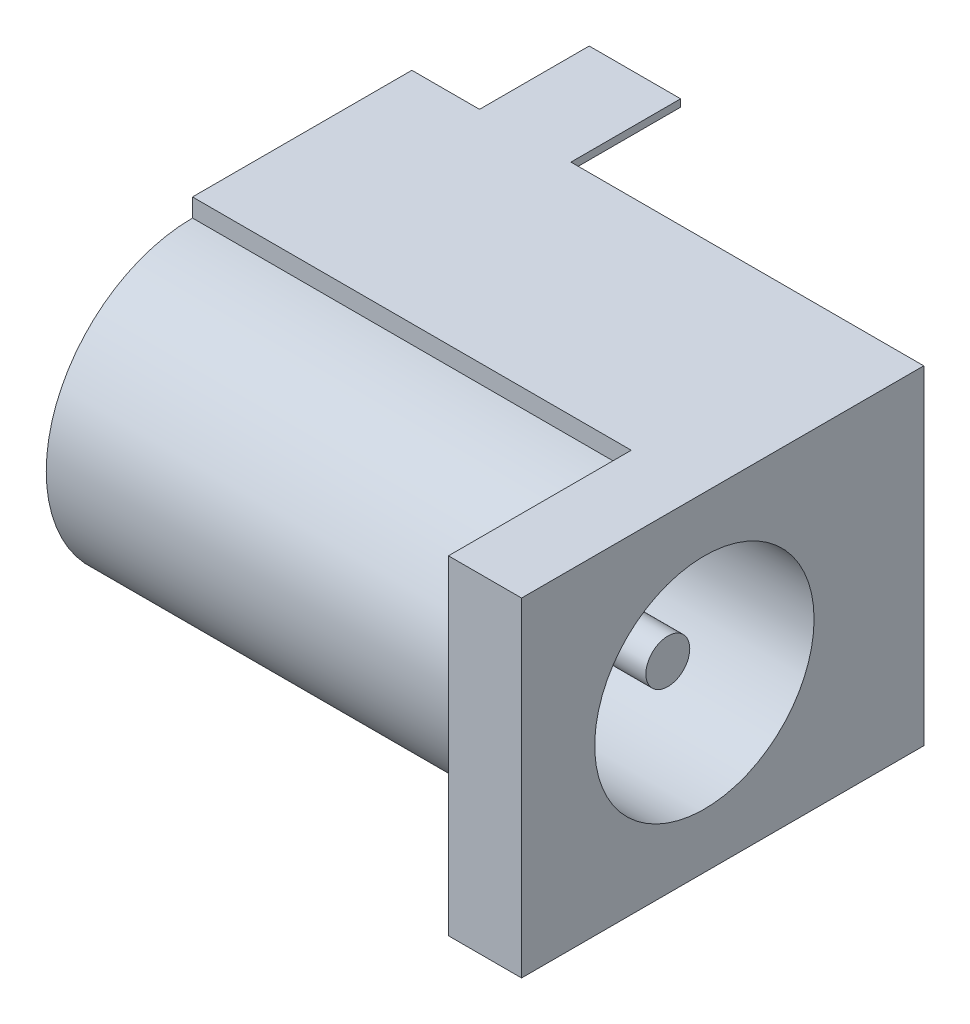
ISO-10303-21;
HEADER;
FILE_DESCRIPTION(('STEP AP214'),'2;1');
FILE_NAME('part.step','',(''),(''),'','','');
FILE_SCHEMA(('AUTOMOTIVE_DESIGN { 1 0 10303 214 1 1 1 1 }'));
ENDSEC;
DATA;
#1=APPLICATION_CONTEXT('core data for automotive mechanical design processes');
#2=APPLICATION_PROTOCOL_DEFINITION('international standard','automotive_design',2000,#1);
#3=PRODUCT_CONTEXT('',#1,'mechanical');
#4=PRODUCT('Part','Part','',(#3));
#5=PRODUCT_RELATED_PRODUCT_CATEGORY('part','',(#4));
#6=PRODUCT_DEFINITION_FORMATION('','',#4);
#7=PRODUCT_DEFINITION_CONTEXT('part definition',#1,'design');
#8=PRODUCT_DEFINITION('design','',#6,#7);
#9=PRODUCT_DEFINITION_SHAPE('','',#8);
#10=(LENGTH_UNIT() NAMED_UNIT(*) SI_UNIT(.MILLI.,.METRE.));
#11=(NAMED_UNIT(*) PLANE_ANGLE_UNIT() SI_UNIT($,.RADIAN.));
#12=(NAMED_UNIT(*) SI_UNIT($,.STERADIAN.) SOLID_ANGLE_UNIT());
#13=UNCERTAINTY_MEASURE_WITH_UNIT(LENGTH_MEASURE(1.E-05),#10,'distance_accuracy_value','');
#14=(GEOMETRIC_REPRESENTATION_CONTEXT(3) GLOBAL_UNCERTAINTY_ASSIGNED_CONTEXT((#13)) GLOBAL_UNIT_ASSIGNED_CONTEXT((#10,
#11,#12)) REPRESENTATION_CONTEXT('',''));
#15=CARTESIAN_POINT('',(0.,0.,0.));
#16=DIRECTION('',(0.,0.,1.));
#17=DIRECTION('',(1.,0.,0.));
#18=AXIS2_PLACEMENT_3D('',#15,#16,#17);
#19=CARTESIAN_POINT('',(7.,-4.5,0.));
#20=DIRECTION('',(0.,0.,-1.));
#21=DIRECTION('',(-1.,0.,0.));
#22=AXIS2_PLACEMENT_3D('',#19,#20,#21);
#23=PLANE('',#22);
#24=DIRECTION('',(-1.,0.,0.));
#25=VECTOR('',#24,1.);
#26=CARTESIAN_POINT('',(0.199999999999969,-1.25,0.));
#27=LINE('',#26,#25);
#28=CARTESIAN_POINT('',(0.199999999999969,-1.25,0.));
#29=VERTEX_POINT('',#28);
#30=CARTESIAN_POINT('',(0.,-1.25,0.));
#31=VERTEX_POINT('',#30);
#32=EDGE_CURVE('E202',#29,#31,#27,.T.);
#33=ORIENTED_EDGE('',*,*,#32,.F.);
#34=DIRECTION('',(0.,-1.,0.));
#35=VECTOR('',#34,1.);
#36=CARTESIAN_POINT('',(0.199999999999969,1.25,0.));
#37=LINE('',#36,#35);
#38=CARTESIAN_POINT('',(0.199999999999969,1.25,0.));
#39=VERTEX_POINT('',#38);
#40=EDGE_CURVE('E199',#39,#29,#37,.T.);
#41=ORIENTED_EDGE('',*,*,#40,.F.);
#42=DIRECTION('',(1.,0.,0.));
#43=VECTOR('',#42,1.);
#44=CARTESIAN_POINT('',(0.199999999999969,1.25,0.));
#45=LINE('',#44,#43);
#46=CARTESIAN_POINT('',(0.,1.25,0.));
#47=VERTEX_POINT('',#46);
#48=EDGE_CURVE('E212',#47,#39,#45,.T.);
#49=ORIENTED_EDGE('',*,*,#48,.F.);
#50=DIRECTION('',(0.,1.,0.));
#51=VECTOR('',#50,1.);
#52=CARTESIAN_POINT('',(0.,1.25,0.));
#53=LINE('',#52,#51);
#54=EDGE_CURVE('E220',#31,#47,#53,.T.);
#55=ORIENTED_EDGE('',*,*,#54,.F.);
#56=EDGE_LOOP('',(#33,#41,#49,#55));
#57=FACE_BOUND('',#56,.T.);
#58=DIRECTION('',(-1.,0.,0.));
#59=VECTOR('',#58,1.);
#60=CARTESIAN_POINT('',(-7.00000000000003,4.5,0.));
#61=LINE('',#60,#59);
#62=CARTESIAN_POINT('',(-5.15000000000003,4.5,0.));
#63=VERTEX_POINT('',#62);
#64=CARTESIAN_POINT('',(-7.00000000000003,4.5,0.));
#65=VERTEX_POINT('',#64);
#66=EDGE_CURVE('E315',#63,#65,#61,.T.);
#67=ORIENTED_EDGE('',*,*,#66,.F.);
#68=DIRECTION('',(0.,1.,0.));
#69=VECTOR('',#68,1.);
#70=CARTESIAN_POINT('',(-5.15000000000003,4.5,0.));
#71=LINE('',#70,#69);
#72=CARTESIAN_POINT('',(-5.15000000000003,4.3,0.));
#73=VERTEX_POINT('',#72);
#74=EDGE_CURVE('E54',#73,#63,#71,.T.);
#75=ORIENTED_EDGE('',*,*,#74,.F.);
#76=DIRECTION('',(-1.,0.,0.));
#77=VECTOR('',#76,1.);
#78=CARTESIAN_POINT('',(-5.15000000000003,4.3,0.));
#79=LINE('',#78,#77);
#80=CARTESIAN_POINT('',(-2.65000000000003,4.3,0.));
#81=VERTEX_POINT('',#80);
#82=EDGE_CURVE('E196',#81,#73,#79,.T.);
#83=ORIENTED_EDGE('',*,*,#82,.F.);
#84=DIRECTION('',(0.,-1.,0.));
#85=VECTOR('',#84,1.);
#86=CARTESIAN_POINT('',(-2.65000000000003,4.5,0.));
#87=LINE('',#86,#85);
#88=CARTESIAN_POINT('',(-2.65000000000003,4.5,0.));
#89=VERTEX_POINT('',#88);
#90=EDGE_CURVE('E314',#89,#81,#87,.T.);
#91=ORIENTED_EDGE('',*,*,#90,.F.);
#92=CARTESIAN_POINT('',(7.,4.5,0.));
#93=VERTEX_POINT('',#92);
#94=EDGE_CURVE('E291',#93,#89,#61,.T.);
#95=ORIENTED_EDGE('',*,*,#94,.F.);
#96=DIRECTION('',(0.,1.,0.));
#97=VECTOR('',#96,1.);
#98=CARTESIAN_POINT('',(7.,4.5,0.));
#99=LINE('',#98,#97);
#100=CARTESIAN_POINT('',(7.,-4.5,0.));
#101=VERTEX_POINT('',#100);
#102=EDGE_CURVE('E312',#101,#93,#99,.T.);
#103=ORIENTED_EDGE('',*,*,#102,.F.);
#104=DIRECTION('',(1.,0.,0.));
#105=VECTOR('',#104,1.);
#106=CARTESIAN_POINT('',(-7.00000000000003,-4.5,0.));
#107=LINE('',#106,#105);
#108=CARTESIAN_POINT('',(-7.00000000000003,-4.5,0.));
#109=VERTEX_POINT('',#108);
#110=EDGE_CURVE('E316',#109,#101,#107,.T.);
#111=ORIENTED_EDGE('',*,*,#110,.F.);
#112=DIRECTION('',(0.,-1.,0.));
#113=VECTOR('',#112,1.);
#114=CARTESIAN_POINT('',(-7.00000000000003,4.5,0.));
#115=LINE('',#114,#113);
#116=CARTESIAN_POINT('',(-7.00000000000003,-1.5,0.));
#117=VERTEX_POINT('',#116);
#118=EDGE_CURVE('E253',#117,#109,#115,.T.);
#119=ORIENTED_EDGE('',*,*,#118,.F.);
#120=DIRECTION('',(-1.,0.,0.));
#121=VECTOR('',#120,1.);
#122=CARTESIAN_POINT('',(-6.80000000000003,-1.5,0.));
#123=LINE('',#122,#121);
#124=CARTESIAN_POINT('',(-6.80000000000003,-1.5,0.));
#125=VERTEX_POINT('',#124);
#126=EDGE_CURVE('E245',#125,#117,#123,.T.);
#127=ORIENTED_EDGE('',*,*,#126,.F.);
#128=DIRECTION('',(0.,-1.,0.));
#129=VECTOR('',#128,1.);
#130=CARTESIAN_POINT('',(-6.80000000000003,1.5,0.));
#131=LINE('',#130,#129);
#132=CARTESIAN_POINT('',(-6.80000000000003,1.5,0.));
#133=VERTEX_POINT('',#132);
#134=EDGE_CURVE('E231',#133,#125,#131,.T.);
#135=ORIENTED_EDGE('',*,*,#134,.F.);
#136=DIRECTION('',(1.,0.,0.));
#137=VECTOR('',#136,1.);
#138=CARTESIAN_POINT('',(-6.80000000000003,1.5,0.));
#139=LINE('',#138,#137);
#140=CARTESIAN_POINT('',(-7.00000000000003,1.5,0.));
#141=VERTEX_POINT('',#140);
#142=EDGE_CURVE('E236',#141,#133,#139,.T.);
#143=ORIENTED_EDGE('',*,*,#142,.F.);
#144=EDGE_CURVE('E280',#65,#141,#115,.T.);
#145=ORIENTED_EDGE('',*,*,#144,.F.);
#146=EDGE_LOOP('',(#67,#75,#83,#91,#95,#103,#111,#119,#127,#135,#143,#145));
#147=FACE_BOUND('',#146,.T.);
#148=ADVANCED_FACE('F37',(#57,#147),#23,.T.);
#149=CARTESIAN_POINT('',(7.,-4.5,11.));
#150=DIRECTION('',(0.,0.,-1.));
#151=DIRECTION('',(-1.,0.,0.));
#152=AXIS2_PLACEMENT_3D('',#149,#150,#151);
#153=PLANE('',#152);
#154=DIRECTION('',(0.,1.,0.));
#155=VECTOR('',#154,1.);
#156=CARTESIAN_POINT('',(4.99999999999997,4.5,11.));
#157=LINE('',#156,#155);
#158=CARTESIAN_POINT('',(4.99999999999997,-4.5,11.));
#159=VERTEX_POINT('',#158);
#160=CARTESIAN_POINT('',(4.99999999999997,4.5,11.));
#161=VERTEX_POINT('',#160);
#162=EDGE_CURVE('E357',#159,#161,#157,.T.);
#163=ORIENTED_EDGE('',*,*,#162,.F.);
#164=DIRECTION('',(1.,0.,0.));
#165=VECTOR('',#164,1.);
#166=CARTESIAN_POINT('',(-7.00000000000003,-4.5,11.));
#167=LINE('',#166,#165);
#168=CARTESIAN_POINT('',(7.,-4.5,11.));
#169=VERTEX_POINT('',#168);
#170=EDGE_CURVE('E288',#159,#169,#167,.T.);
#171=ORIENTED_EDGE('',*,*,#170,.T.);
#172=DIRECTION('',(0.,1.,0.));
#173=VECTOR('',#172,1.);
#174=CARTESIAN_POINT('',(7.,4.5,11.));
#175=LINE('',#174,#173);
#176=CARTESIAN_POINT('',(7.,4.5,11.));
#177=VERTEX_POINT('',#176);
#178=EDGE_CURVE('E289',#169,#177,#175,.T.);
#179=ORIENTED_EDGE('',*,*,#178,.T.);
#180=DIRECTION('',(-1.,0.,0.));
#181=VECTOR('',#180,1.);
#182=CARTESIAN_POINT('',(-7.00000000000003,4.5,11.));
#183=LINE('',#182,#181);
#184=EDGE_CURVE('E301',#177,#161,#183,.T.);
#185=ORIENTED_EDGE('',*,*,#184,.T.);
#186=EDGE_LOOP('',(#163,#171,#179,#185));
#187=FACE_BOUND('',#186,.T.);
#188=ADVANCED_FACE('F401',(#187),#153,.F.);
#189=CARTESIAN_POINT('',(-1.,0.,6.));
#190=DIRECTION('',(1.,0.,0.));
#191=DIRECTION('',(0.,0.,-1.));
#192=AXIS2_PLACEMENT_3D('',#189,#190,#191);
#193=PLANE('',#192);
#194=CARTESIAN_POINT('',(-1.,0.,6.));
#195=DIRECTION('',(1.,0.,0.));
#196=DIRECTION('',(0.,0.,-1.));
#197=AXIS2_PLACEMENT_3D('',#194,#195,#196);
#198=CIRCLE('',#197,3.);
#199=CARTESIAN_POINT('',(-1.,0.,3.));
#200=VERTEX_POINT('',#199);
#201=EDGE_CURVE('E318',#200,#200,#198,.T.);
#202=ORIENTED_EDGE('',*,*,#201,.T.);
#203=EDGE_LOOP('',(#202));
#204=FACE_BOUND('',#203,.T.);
#205=CARTESIAN_POINT('',(-1.,0.,6.));
#206=DIRECTION('',(1.,0.,0.));
#207=DIRECTION('',(0.,0.,-1.));
#208=AXIS2_PLACEMENT_3D('',#205,#206,#207);
#209=CIRCLE('',#208,0.6);
#210=CARTESIAN_POINT('',(-1.,0.,5.4));
#211=VERTEX_POINT('',#210);
#212=EDGE_CURVE('E329',#211,#211,#209,.T.);
#213=ORIENTED_EDGE('',*,*,#212,.F.);
#214=EDGE_LOOP('',(#213));
#215=FACE_BOUND('',#214,.T.);
#216=ADVANCED_FACE('F407',(#204,#215),#193,.T.);
#217=CARTESIAN_POINT('',(-7.00000000000003,-4.5,11.));
#218=DIRECTION('',(0.,1.,0.));
#219=DIRECTION('',(0.,0.,1.));
#220=AXIS2_PLACEMENT_3D('',#217,#218,#219);
#221=PLANE('',#220);
#222=DIRECTION('',(0.,0.,1.));
#223=VECTOR('',#222,1.);
#224=CARTESIAN_POINT('',(4.99999999999997,-4.5,11.));
#225=LINE('',#224,#223);
#226=CARTESIAN_POINT('',(4.99999999999997,-4.5,6.));
#227=VERTEX_POINT('',#226);
#228=EDGE_CURVE('E359',#227,#159,#225,.T.);
#229=ORIENTED_EDGE('',*,*,#228,.F.);
#230=DIRECTION('',(-1.,0.,0.));
#231=VECTOR('',#230,1.);
#232=CARTESIAN_POINT('',(4.99999999999997,-4.5,6.));
#233=LINE('',#232,#231);
#234=CARTESIAN_POINT('',(-7.00000000000003,-4.5,6.));
#235=VERTEX_POINT('',#234);
#236=EDGE_CURVE('E337',#227,#235,#233,.T.);
#237=ORIENTED_EDGE('',*,*,#236,.T.);
#238=DIRECTION('',(0.,0.,-1.));
#239=VECTOR('',#238,1.);
#240=CARTESIAN_POINT('',(-7.00000000000003,-4.5,11.));
#241=LINE('',#240,#239);
#242=EDGE_CURVE('E297',#235,#109,#241,.T.);
#243=ORIENTED_EDGE('',*,*,#242,.T.);
#244=ORIENTED_EDGE('',*,*,#110,.T.);
#245=DIRECTION('',(0.,0.,-1.));
#246=VECTOR('',#245,1.);
#247=CARTESIAN_POINT('',(7.,-4.5,11.));
#248=LINE('',#247,#246);
#249=EDGE_CURVE('E11',#169,#101,#248,.T.);
#250=ORIENTED_EDGE('',*,*,#249,.F.);
#251=ORIENTED_EDGE('',*,*,#170,.F.);
#252=EDGE_LOOP('',(#229,#237,#243,#244,#250,#251));
#253=FACE_BOUND('',#252,.T.);
#254=ADVANCED_FACE('F39',(#253),#221,.F.);
#255=CARTESIAN_POINT('',(7.,4.5,11.));
#256=DIRECTION('',(-1.,0.,0.));
#257=DIRECTION('',(0.,0.,1.));
#258=AXIS2_PLACEMENT_3D('',#255,#256,#257);
#259=PLANE('',#258);
#260=CARTESIAN_POINT('',(7.,0.,6.));
#261=DIRECTION('',(1.,0.,0.));
#262=DIRECTION('',(0.,0.,-1.));
#263=AXIS2_PLACEMENT_3D('',#260,#261,#262);
#264=CIRCLE('',#263,3.);
#265=CARTESIAN_POINT('',(7.,0.,3.));
#266=VERTEX_POINT('',#265);
#267=EDGE_CURVE('E323',#266,#266,#264,.T.);
#268=ORIENTED_EDGE('',*,*,#267,.F.);
#269=EDGE_LOOP('',(#268));
#270=FACE_BOUND('',#269,.T.);
#271=ORIENTED_EDGE('',*,*,#102,.T.);
#272=DIRECTION('',(0.,0.,-1.));
#273=VECTOR('',#272,1.);
#274=CARTESIAN_POINT('',(7.,4.5,11.));
#275=LINE('',#274,#273);
#276=EDGE_CURVE('E46',#177,#93,#275,.T.);
#277=ORIENTED_EDGE('',*,*,#276,.F.);
#278=ORIENTED_EDGE('',*,*,#178,.F.);
#279=ORIENTED_EDGE('',*,*,#249,.T.);
#280=EDGE_LOOP('',(#271,#277,#278,#279));
#281=FACE_BOUND('',#280,.T.);
#282=ADVANCED_FACE('F417',(#270,#281),#259,.F.);
#283=CARTESIAN_POINT('',(-7.00000000000003,4.5,11.));
#284=DIRECTION('',(0.,-1.,0.));
#285=DIRECTION('',(0.,0.,-1.));
#286=AXIS2_PLACEMENT_3D('',#283,#284,#285);
#287=PLANE('',#286);
#288=DIRECTION('',(0.,0.,-1.));
#289=VECTOR('',#288,1.);
#290=CARTESIAN_POINT('',(-7.00000000000003,4.5,11.));
#291=LINE('',#290,#289);
#292=CARTESIAN_POINT('',(-7.00000000000003,4.5,6.));
#293=VERTEX_POINT('',#292);
#294=EDGE_CURVE('E287',#293,#65,#291,.T.);
#295=ORIENTED_EDGE('',*,*,#294,.F.);
#296=DIRECTION('',(-1.,0.,0.));
#297=VECTOR('',#296,1.);
#298=CARTESIAN_POINT('',(4.99999999999997,4.5,6.));
#299=LINE('',#298,#297);
#300=CARTESIAN_POINT('',(4.99999999999997,4.5,6.));
#301=VERTEX_POINT('',#300);
#302=EDGE_CURVE('E341',#301,#293,#299,.T.);
#303=ORIENTED_EDGE('',*,*,#302,.F.);
#304=DIRECTION('',(0.,0.,-1.));
#305=VECTOR('',#304,1.);
#306=CARTESIAN_POINT('',(4.99999999999997,4.5,6.));
#307=LINE('',#306,#305);
#308=EDGE_CURVE('E355',#161,#301,#307,.T.);
#309=ORIENTED_EDGE('',*,*,#308,.F.);
#310=ORIENTED_EDGE('',*,*,#184,.F.);
#311=ORIENTED_EDGE('',*,*,#276,.T.);
#312=ORIENTED_EDGE('',*,*,#94,.T.);
#313=DIRECTION('',(0.,0.,1.));
#314=VECTOR('',#313,1.);
#315=CARTESIAN_POINT('',(-2.65000000000003,4.5,-3.));
#316=LINE('',#315,#314);
#317=CARTESIAN_POINT('',(-2.65000000000003,4.5,-3.));
#318=VERTEX_POINT('',#317);
#319=EDGE_CURVE('E185',#318,#89,#316,.T.);
#320=ORIENTED_EDGE('',*,*,#319,.F.);
#321=DIRECTION('',(1.,0.,0.));
#322=VECTOR('',#321,1.);
#323=CARTESIAN_POINT('',(-2.65000000000003,4.5,-3.));
#324=LINE('',#323,#322);
#325=CARTESIAN_POINT('',(-5.15000000000003,4.5,-3.));
#326=VERTEX_POINT('',#325);
#327=EDGE_CURVE('E178',#326,#318,#324,.T.);
#328=ORIENTED_EDGE('',*,*,#327,.F.);
#329=DIRECTION('',(0.,0.,1.));
#330=VECTOR('',#329,1.);
#331=CARTESIAN_POINT('',(-5.15000000000003,4.5,-3.));
#332=LINE('',#331,#330);
#333=EDGE_CURVE('E182',#326,#63,#332,.T.);
#334=ORIENTED_EDGE('',*,*,#333,.T.);
#335=ORIENTED_EDGE('',*,*,#66,.T.);
#336=EDGE_LOOP('',(#295,#303,#309,#310,#311,#312,#320,#328,#334,#335));
#337=FACE_BOUND('',#336,.T.);
#338=ADVANCED_FACE('F181',(#337),#287,.F.);
#339=CARTESIAN_POINT('',(-7.00000000000003,4.5,11.));
#340=DIRECTION('',(1.,0.,0.));
#341=DIRECTION('',(0.,0.,-1.));
#342=AXIS2_PLACEMENT_3D('',#339,#340,#341);
#343=PLANE('',#342);
#344=CARTESIAN_POINT('',(-7.00000000000003,0.,6.));
#345=DIRECTION('',(1.,0.,0.));
#346=DIRECTION('',(0.,0.,1.));
#347=AXIS2_PLACEMENT_3D('',#344,#345,#346);
#348=CIRCLE('',#347,4.);
#349=CARTESIAN_POINT('',(-7.00000000000003,4.,6.));
#350=VERTEX_POINT('',#349);
#351=CARTESIAN_POINT('',(-7.00000000000003,-4.,6.));
#352=VERTEX_POINT('',#351);
#353=EDGE_CURVE('E350',#350,#352,#348,.T.);
#354=ORIENTED_EDGE('',*,*,#353,.F.);
#355=DIRECTION('',(0.,-1.,0.));
#356=VECTOR('',#355,1.);
#357=CARTESIAN_POINT('',(-7.00000000000003,4.,6.));
#358=LINE('',#357,#356);
#359=EDGE_CURVE('E344',#293,#350,#358,.T.);
#360=ORIENTED_EDGE('',*,*,#359,.F.);
#361=ORIENTED_EDGE('',*,*,#294,.T.);
#362=ORIENTED_EDGE('',*,*,#144,.T.);
#363=DIRECTION('',(0.,0.,1.));
#364=VECTOR('',#363,1.);
#365=CARTESIAN_POINT('',(-7.00000000000003,1.5,-3.));
#366=LINE('',#365,#364);
#367=CARTESIAN_POINT('',(-7.00000000000003,1.5,-3.));
#368=VERTEX_POINT('',#367);
#369=EDGE_CURVE('E260',#368,#141,#366,.T.);
#370=ORIENTED_EDGE('',*,*,#369,.F.);
#371=DIRECTION('',(0.,1.,0.));
#372=VECTOR('',#371,1.);
#373=CARTESIAN_POINT('',(-7.00000000000003,1.5,-3.));
#374=LINE('',#373,#372);
#375=CARTESIAN_POINT('',(-7.00000000000003,-1.5,-3.));
#376=VERTEX_POINT('',#375);
#377=EDGE_CURVE('E238',#376,#368,#374,.T.);
#378=ORIENTED_EDGE('',*,*,#377,.F.);
#379=DIRECTION('',(0.,0.,1.));
#380=VECTOR('',#379,1.);
#381=CARTESIAN_POINT('',(-7.00000000000003,-1.5,-3.));
#382=LINE('',#381,#380);
#383=EDGE_CURVE('E256',#376,#117,#382,.T.);
#384=ORIENTED_EDGE('',*,*,#383,.T.);
#385=ORIENTED_EDGE('',*,*,#118,.T.);
#386=ORIENTED_EDGE('',*,*,#242,.F.);
#387=DIRECTION('',(0.,-1.,0.));
#388=VECTOR('',#387,1.);
#389=CARTESIAN_POINT('',(-7.00000000000003,-4.5,6.));
#390=LINE('',#389,#388);
#391=EDGE_CURVE('E348',#352,#235,#390,.T.);
#392=ORIENTED_EDGE('',*,*,#391,.F.);
#393=EDGE_LOOP('',(#354,#360,#361,#362,#370,#378,#384,#385,#386,#392));
#394=FACE_BOUND('',#393,.T.);
#395=ADVANCED_FACE('F284',(#394),#343,.F.);
#396=CARTESIAN_POINT('',(-1.,0.,6.));
#397=DIRECTION('',(1.,0.,0.));
#398=DIRECTION('',(0.,0.,-1.));
#399=AXIS2_PLACEMENT_3D('',#396,#397,#398);
#400=CYLINDRICAL_SURFACE('',#399,3.);
#401=ORIENTED_EDGE('',*,*,#201,.F.);
#402=EDGE_LOOP('',(#401));
#403=FACE_BOUND('',#402,.T.);
#404=ORIENTED_EDGE('',*,*,#267,.T.);
#405=EDGE_LOOP('',(#404));
#406=FACE_BOUND('',#405,.T.);
#407=ADVANCED_FACE('F415',(#403,#406),#400,.F.);
#408=CARTESIAN_POINT('',(6.,0.,6.));
#409=DIRECTION('',(-1.,0.,0.));
#410=DIRECTION('',(0.,0.,1.));
#411=AXIS2_PLACEMENT_3D('',#408,#409,#410);
#412=CYLINDRICAL_SURFACE('',#411,0.6);
#413=CARTESIAN_POINT('',(6.,0.,6.));
#414=DIRECTION('',(1.,0.,0.));
#415=DIRECTION('',(0.,0.,-1.));
#416=AXIS2_PLACEMENT_3D('',#413,#414,#415);
#417=CIRCLE('',#416,0.6);
#418=CARTESIAN_POINT('',(6.,0.,5.4));
#419=VERTEX_POINT('',#418);
#420=EDGE_CURVE('E326',#419,#419,#417,.T.);
#421=ORIENTED_EDGE('',*,*,#420,.F.);
#422=EDGE_LOOP('',(#421));
#423=FACE_BOUND('',#422,.T.);
#424=ORIENTED_EDGE('',*,*,#212,.T.);
#425=EDGE_LOOP('',(#424));
#426=FACE_BOUND('',#425,.T.);
#427=ADVANCED_FACE('F426',(#423,#426),#412,.T.);
#428=CARTESIAN_POINT('',(6.,0.,6.));
#429=DIRECTION('',(1.,0.,0.));
#430=DIRECTION('',(0.,0.,-1.));
#431=AXIS2_PLACEMENT_3D('',#428,#429,#430);
#432=PLANE('',#431);
#433=ORIENTED_EDGE('',*,*,#420,.T.);
#434=EDGE_LOOP('',(#433));
#435=FACE_BOUND('',#434,.T.);
#436=ADVANCED_FACE('F397',(#435),#432,.T.);
#437=CARTESIAN_POINT('',(4.99999999999997,0.,6.));
#438=DIRECTION('',(-1.,0.,0.));
#439=DIRECTION('',(0.,0.,1.));
#440=AXIS2_PLACEMENT_3D('',#437,#438,#439);
#441=CYLINDRICAL_SURFACE('',#440,4.);
#442=ORIENTED_EDGE('',*,*,#353,.T.);
#443=DIRECTION('',(-1.,0.,0.));
#444=VECTOR('',#443,1.);
#445=CARTESIAN_POINT('',(4.99999999999997,-4.,6.));
#446=LINE('',#445,#444);
#447=CARTESIAN_POINT('',(4.99999999999997,-4.,6.));
#448=VERTEX_POINT('',#447);
#449=EDGE_CURVE('E335',#448,#352,#446,.T.);
#450=ORIENTED_EDGE('',*,*,#449,.F.);
#451=CARTESIAN_POINT('',(4.99999999999997,0.,6.));
#452=DIRECTION('',(1.,0.,0.));
#453=DIRECTION('',(0.,0.,1.));
#454=AXIS2_PLACEMENT_3D('',#451,#452,#453);
#455=CIRCLE('',#454,4.);
#456=CARTESIAN_POINT('',(4.99999999999997,4.,6.));
#457=VERTEX_POINT('',#456);
#458=EDGE_CURVE('E347',#457,#448,#455,.T.);
#459=ORIENTED_EDGE('',*,*,#458,.F.);
#460=DIRECTION('',(-1.,0.,0.));
#461=VECTOR('',#460,1.);
#462=CARTESIAN_POINT('',(4.99999999999997,4.,6.));
#463=LINE('',#462,#461);
#464=EDGE_CURVE('E332',#457,#350,#463,.T.);
#465=ORIENTED_EDGE('',*,*,#464,.T.);
#466=EDGE_LOOP('',(#442,#450,#459,#465));
#467=FACE_BOUND('',#466,.T.);
#468=ADVANCED_FACE('F386',(#467),#441,.T.);
#469=CARTESIAN_POINT('',(4.99999999999997,4.,6.));
#470=DIRECTION('',(0.,0.,-1.));
#471=DIRECTION('',(-1.,0.,0.));
#472=AXIS2_PLACEMENT_3D('',#469,#470,#471);
#473=PLANE('',#472);
#474=ORIENTED_EDGE('',*,*,#359,.T.);
#475=ORIENTED_EDGE('',*,*,#464,.F.);
#476=DIRECTION('',(0.,-1.,0.));
#477=VECTOR('',#476,1.);
#478=CARTESIAN_POINT('',(4.99999999999997,4.,6.));
#479=LINE('',#478,#477);
#480=EDGE_CURVE('E338',#301,#457,#479,.T.);
#481=ORIENTED_EDGE('',*,*,#480,.F.);
#482=ORIENTED_EDGE('',*,*,#302,.T.);
#483=EDGE_LOOP('',(#474,#475,#481,#482));
#484=FACE_BOUND('',#483,.T.);
#485=ADVANCED_FACE('F389',(#484),#473,.F.);
#486=CARTESIAN_POINT('',(4.99999999999997,-4.5,6.));
#487=DIRECTION('',(0.,0.,-1.));
#488=DIRECTION('',(-1.,0.,0.));
#489=AXIS2_PLACEMENT_3D('',#486,#487,#488);
#490=PLANE('',#489);
#491=ORIENTED_EDGE('',*,*,#391,.T.);
#492=ORIENTED_EDGE('',*,*,#236,.F.);
#493=DIRECTION('',(0.,-1.,0.));
#494=VECTOR('',#493,1.);
#495=CARTESIAN_POINT('',(4.99999999999997,-4.5,6.));
#496=LINE('',#495,#494);
#497=EDGE_CURVE('E361',#448,#227,#496,.T.);
#498=ORIENTED_EDGE('',*,*,#497,.F.);
#499=ORIENTED_EDGE('',*,*,#449,.T.);
#500=EDGE_LOOP('',(#491,#492,#498,#499));
#501=FACE_BOUND('',#500,.T.);
#502=ADVANCED_FACE('F379',(#501),#490,.F.);
#503=CARTESIAN_POINT('',(4.99999999999997,0.,6.));
#504=DIRECTION('',(-1.,0.,0.));
#505=DIRECTION('',(0.,0.,1.));
#506=AXIS2_PLACEMENT_3D('',#503,#504,#505);
#507=PLANE('',#506);
#508=ORIENTED_EDGE('',*,*,#458,.T.);
#509=ORIENTED_EDGE('',*,*,#497,.T.);
#510=ORIENTED_EDGE('',*,*,#228,.T.);
#511=ORIENTED_EDGE('',*,*,#162,.T.);
#512=ORIENTED_EDGE('',*,*,#308,.T.);
#513=ORIENTED_EDGE('',*,*,#480,.T.);
#514=EDGE_LOOP('',(#508,#509,#510,#511,#512,#513));
#515=FACE_BOUND('',#514,.T.);
#516=ADVANCED_FACE('F381',(#515),#507,.T.);
#517=CARTESIAN_POINT('',(-6.80000000000003,1.5,-3.));
#518=DIRECTION('',(-1.,0.,0.));
#519=DIRECTION('',(0.,0.,1.));
#520=AXIS2_PLACEMENT_3D('',#517,#518,#519);
#521=PLANE('',#520);
#522=ORIENTED_EDGE('',*,*,#134,.T.);
#523=DIRECTION('',(0.,0.,1.));
#524=VECTOR('',#523,1.);
#525=CARTESIAN_POINT('',(-6.80000000000003,-1.5,-3.));
#526=LINE('',#525,#524);
#527=CARTESIAN_POINT('',(-6.80000000000003,-1.5,-3.));
#528=VERTEX_POINT('',#527);
#529=EDGE_CURVE('E259',#528,#125,#526,.T.);
#530=ORIENTED_EDGE('',*,*,#529,.F.);
#531=DIRECTION('',(0.,-1.,0.));
#532=VECTOR('',#531,1.);
#533=CARTESIAN_POINT('',(-6.80000000000003,1.5,-3.));
#534=LINE('',#533,#532);
#535=CARTESIAN_POINT('',(-6.80000000000003,1.5,-3.));
#536=VERTEX_POINT('',#535);
#537=EDGE_CURVE('E232',#536,#528,#534,.T.);
#538=ORIENTED_EDGE('',*,*,#537,.F.);
#539=DIRECTION('',(0.,0.,1.));
#540=VECTOR('',#539,1.);
#541=CARTESIAN_POINT('',(-6.80000000000003,1.5,-3.));
#542=LINE('',#541,#540);
#543=EDGE_CURVE('E242',#536,#133,#542,.T.);
#544=ORIENTED_EDGE('',*,*,#543,.T.);
#545=EDGE_LOOP('',(#522,#530,#538,#544));
#546=FACE_BOUND('',#545,.T.);
#547=ADVANCED_FACE('F274',(#546),#521,.F.);
#548=CARTESIAN_POINT('',(-6.80000000000003,-1.5,-3.));
#549=DIRECTION('',(0.,1.,0.));
#550=DIRECTION('',(0.,0.,1.));
#551=AXIS2_PLACEMENT_3D('',#548,#549,#550);
#552=PLANE('',#551);
#553=ORIENTED_EDGE('',*,*,#126,.T.);
#554=ORIENTED_EDGE('',*,*,#383,.F.);
#555=DIRECTION('',(-1.,0.,0.));
#556=VECTOR('',#555,1.);
#557=CARTESIAN_POINT('',(-6.80000000000003,-1.5,-3.));
#558=LINE('',#557,#556);
#559=EDGE_CURVE('E235',#528,#376,#558,.T.);
#560=ORIENTED_EDGE('',*,*,#559,.F.);
#561=ORIENTED_EDGE('',*,*,#529,.T.);
#562=EDGE_LOOP('',(#553,#554,#560,#561));
#563=FACE_BOUND('',#562,.T.);
#564=ADVANCED_FACE('F367',(#563),#552,.F.);
#565=CARTESIAN_POINT('',(-6.80000000000003,1.5,-3.));
#566=DIRECTION('',(0.,-1.,0.));
#567=DIRECTION('',(0.,0.,-1.));
#568=AXIS2_PLACEMENT_3D('',#565,#566,#567);
#569=PLANE('',#568);
#570=ORIENTED_EDGE('',*,*,#142,.T.);
#571=ORIENTED_EDGE('',*,*,#543,.F.);
#572=DIRECTION('',(1.,0.,0.));
#573=VECTOR('',#572,1.);
#574=CARTESIAN_POINT('',(-6.80000000000003,1.5,-3.));
#575=LINE('',#574,#573);
#576=EDGE_CURVE('E240',#368,#536,#575,.T.);
#577=ORIENTED_EDGE('',*,*,#576,.F.);
#578=ORIENTED_EDGE('',*,*,#369,.T.);
#579=EDGE_LOOP('',(#570,#571,#577,#578));
#580=FACE_BOUND('',#579,.T.);
#581=ADVANCED_FACE('F276',(#580),#569,.F.);
#582=CARTESIAN_POINT('',(-6.80000000000003,-1.5,-3.));
#583=DIRECTION('',(0.,0.,-1.));
#584=DIRECTION('',(-1.,0.,0.));
#585=AXIS2_PLACEMENT_3D('',#582,#583,#584);
#586=PLANE('',#585);
#587=ORIENTED_EDGE('',*,*,#537,.T.);
#588=ORIENTED_EDGE('',*,*,#559,.T.);
#589=ORIENTED_EDGE('',*,*,#377,.T.);
#590=ORIENTED_EDGE('',*,*,#576,.T.);
#591=EDGE_LOOP('',(#587,#588,#589,#590));
#592=FACE_BOUND('',#591,.T.);
#593=ADVANCED_FACE('F370',(#592),#586,.T.);
#594=CARTESIAN_POINT('',(0.199999999999969,1.25,-3.));
#595=DIRECTION('',(-1.,0.,0.));
#596=DIRECTION('',(0.,0.,1.));
#597=AXIS2_PLACEMENT_3D('',#594,#595,#596);
#598=PLANE('',#597);
#599=ORIENTED_EDGE('',*,*,#40,.T.);
#600=DIRECTION('',(0.,0.,1.));
#601=VECTOR('',#600,1.);
#602=CARTESIAN_POINT('',(0.199999999999969,-1.25,-3.));
#603=LINE('',#602,#601);
#604=CARTESIAN_POINT('',(0.199999999999969,-1.25,-3.));
#605=VERTEX_POINT('',#604);
#606=EDGE_CURVE('E229',#605,#29,#603,.T.);
#607=ORIENTED_EDGE('',*,*,#606,.F.);
#608=DIRECTION('',(0.,-1.,0.));
#609=VECTOR('',#608,1.);
#610=CARTESIAN_POINT('',(0.199999999999969,1.25,-3.));
#611=LINE('',#610,#609);
#612=CARTESIAN_POINT('',(0.199999999999969,1.25,-3.));
#613=VERTEX_POINT('',#612);
#614=EDGE_CURVE('E208',#613,#605,#611,.T.);
#615=ORIENTED_EDGE('',*,*,#614,.F.);
#616=DIRECTION('',(0.,0.,1.));
#617=VECTOR('',#616,1.);
#618=CARTESIAN_POINT('',(0.199999999999969,1.25,-3.));
#619=LINE('',#618,#617);
#620=EDGE_CURVE('E217',#613,#39,#619,.T.);
#621=ORIENTED_EDGE('',*,*,#620,.T.);
#622=EDGE_LOOP('',(#599,#607,#615,#621));
#623=FACE_BOUND('',#622,.T.);
#624=ADVANCED_FACE('F536',(#623),#598,.F.);
#625=CARTESIAN_POINT('',(0.199999999999969,-1.25,-3.));
#626=DIRECTION('',(0.,1.,0.));
#627=DIRECTION('',(0.,0.,1.));
#628=AXIS2_PLACEMENT_3D('',#625,#626,#627);
#629=PLANE('',#628);
#630=ORIENTED_EDGE('',*,*,#32,.T.);
#631=DIRECTION('',(0.,0.,1.));
#632=VECTOR('',#631,1.);
#633=CARTESIAN_POINT('',(0.,-1.25,-3.));
#634=LINE('',#633,#632);
#635=CARTESIAN_POINT('',(0.,-1.25,-3.));
#636=VERTEX_POINT('',#635);
#637=EDGE_CURVE('E226',#636,#31,#634,.T.);
#638=ORIENTED_EDGE('',*,*,#637,.F.);
#639=DIRECTION('',(-1.,0.,0.));
#640=VECTOR('',#639,1.);
#641=CARTESIAN_POINT('',(0.199999999999969,-1.25,-3.));
#642=LINE('',#641,#640);
#643=EDGE_CURVE('E211',#605,#636,#642,.T.);
#644=ORIENTED_EDGE('',*,*,#643,.F.);
#645=ORIENTED_EDGE('',*,*,#606,.T.);
#646=EDGE_LOOP('',(#630,#638,#644,#645));
#647=FACE_BOUND('',#646,.T.);
#648=ADVANCED_FACE('F544',(#647),#629,.F.);
#649=CARTESIAN_POINT('',(0.,1.25,-3.));
#650=DIRECTION('',(1.,0.,0.));
#651=DIRECTION('',(0.,0.,-1.));
#652=AXIS2_PLACEMENT_3D('',#649,#650,#651);
#653=PLANE('',#652);
#654=ORIENTED_EDGE('',*,*,#54,.T.);
#655=DIRECTION('',(0.,0.,1.));
#656=VECTOR('',#655,1.);
#657=CARTESIAN_POINT('',(0.,1.25,-3.));
#658=LINE('',#657,#656);
#659=CARTESIAN_POINT('',(0.,1.25,-3.));
#660=VERTEX_POINT('',#659);
#661=EDGE_CURVE('E62',#660,#47,#658,.T.);
#662=ORIENTED_EDGE('',*,*,#661,.F.);
#663=DIRECTION('',(0.,1.,0.));
#664=VECTOR('',#663,1.);
#665=CARTESIAN_POINT('',(0.,1.25,-3.));
#666=LINE('',#665,#664);
#667=EDGE_CURVE('E214',#636,#660,#666,.T.);
#668=ORIENTED_EDGE('',*,*,#667,.F.);
#669=ORIENTED_EDGE('',*,*,#637,.T.);
#670=EDGE_LOOP('',(#654,#662,#668,#669));
#671=FACE_BOUND('',#670,.T.);
#672=ADVANCED_FACE('F553',(#671),#653,.F.);
#673=CARTESIAN_POINT('',(0.199999999999969,1.25,-3.));
#674=DIRECTION('',(0.,-1.,0.));
#675=DIRECTION('',(0.,0.,-1.));
#676=AXIS2_PLACEMENT_3D('',#673,#674,#675);
#677=PLANE('',#676);
#678=ORIENTED_EDGE('',*,*,#48,.T.);
#679=ORIENTED_EDGE('',*,*,#620,.F.);
#680=DIRECTION('',(1.,0.,0.));
#681=VECTOR('',#680,1.);
#682=CARTESIAN_POINT('',(0.199999999999969,1.25,-3.));
#683=LINE('',#682,#681);
#684=EDGE_CURVE('E216',#660,#613,#683,.T.);
#685=ORIENTED_EDGE('',*,*,#684,.F.);
#686=ORIENTED_EDGE('',*,*,#661,.T.);
#687=EDGE_LOOP('',(#678,#679,#685,#686));
#688=FACE_BOUND('',#687,.T.);
#689=ADVANCED_FACE('F562',(#688),#677,.F.);
#690=CARTESIAN_POINT('',(0.199999999999969,-1.25,-3.));
#691=DIRECTION('',(0.,0.,-1.));
#692=DIRECTION('',(-1.,0.,0.));
#693=AXIS2_PLACEMENT_3D('',#690,#691,#692);
#694=PLANE('',#693);
#695=ORIENTED_EDGE('',*,*,#614,.T.);
#696=ORIENTED_EDGE('',*,*,#643,.T.);
#697=ORIENTED_EDGE('',*,*,#667,.T.);
#698=ORIENTED_EDGE('',*,*,#684,.T.);
#699=EDGE_LOOP('',(#695,#696,#697,#698));
#700=FACE_BOUND('',#699,.T.);
#701=ADVANCED_FACE('F571',(#700),#694,.T.);
#702=CARTESIAN_POINT('',(-5.15000000000003,4.5,-3.));
#703=DIRECTION('',(1.,0.,0.));
#704=DIRECTION('',(0.,0.,-1.));
#705=AXIS2_PLACEMENT_3D('',#702,#703,#704);
#706=PLANE('',#705);
#707=ORIENTED_EDGE('',*,*,#74,.T.);
#708=ORIENTED_EDGE('',*,*,#333,.F.);
#709=DIRECTION('',(0.,1.,0.));
#710=VECTOR('',#709,1.);
#711=CARTESIAN_POINT('',(-5.15000000000003,4.5,-3.));
#712=LINE('',#711,#710);
#713=CARTESIAN_POINT('',(-5.15000000000003,4.3,-3.));
#714=VERTEX_POINT('',#713);
#715=EDGE_CURVE('E189',#714,#326,#712,.T.);
#716=ORIENTED_EDGE('',*,*,#715,.F.);
#717=DIRECTION('',(0.,0.,1.));
#718=VECTOR('',#717,1.);
#719=CARTESIAN_POINT('',(-5.15000000000003,4.3,-3.));
#720=LINE('',#719,#718);
#721=EDGE_CURVE('E627',#714,#73,#720,.T.);
#722=ORIENTED_EDGE('',*,*,#721,.T.);
#723=EDGE_LOOP('',(#707,#708,#716,#722));
#724=FACE_BOUND('',#723,.T.);
#725=ADVANCED_FACE('F198',(#724),#706,.F.);
#726=CARTESIAN_POINT('',(-2.65000000000003,4.5,-3.));
#727=DIRECTION('',(-1.,0.,0.));
#728=DIRECTION('',(0.,0.,1.));
#729=AXIS2_PLACEMENT_3D('',#726,#727,#728);
#730=PLANE('',#729);
#731=ORIENTED_EDGE('',*,*,#90,.T.);
#732=DIRECTION('',(0.,0.,1.));
#733=VECTOR('',#732,1.);
#734=CARTESIAN_POINT('',(-2.65000000000003,4.3,-3.));
#735=LINE('',#734,#733);
#736=CARTESIAN_POINT('',(-2.65000000000003,4.3,-3.));
#737=VERTEX_POINT('',#736);
#738=EDGE_CURVE('E204',#737,#81,#735,.T.);
#739=ORIENTED_EDGE('',*,*,#738,.F.);
#740=DIRECTION('',(0.,-1.,0.));
#741=VECTOR('',#740,1.);
#742=CARTESIAN_POINT('',(-2.65000000000003,4.5,-3.));
#743=LINE('',#742,#741);
#744=EDGE_CURVE('E188',#318,#737,#743,.T.);
#745=ORIENTED_EDGE('',*,*,#744,.F.);
#746=ORIENTED_EDGE('',*,*,#319,.T.);
#747=EDGE_LOOP('',(#731,#739,#745,#746));
#748=FACE_BOUND('',#747,.T.);
#749=ADVANCED_FACE('F587',(#748),#730,.F.);
#750=CARTESIAN_POINT('',(-5.15000000000003,4.3,-3.));
#751=DIRECTION('',(0.,1.,0.));
#752=DIRECTION('',(0.,0.,1.));
#753=AXIS2_PLACEMENT_3D('',#750,#751,#752);
#754=PLANE('',#753);
#755=ORIENTED_EDGE('',*,*,#82,.T.);
#756=ORIENTED_EDGE('',*,*,#721,.F.);
#757=DIRECTION('',(-1.,0.,0.));
#758=VECTOR('',#757,1.);
#759=CARTESIAN_POINT('',(-5.15000000000003,4.3,-3.));
#760=LINE('',#759,#758);
#761=EDGE_CURVE('E194',#737,#714,#760,.T.);
#762=ORIENTED_EDGE('',*,*,#761,.F.);
#763=ORIENTED_EDGE('',*,*,#738,.T.);
#764=EDGE_LOOP('',(#755,#756,#762,#763));
#765=FACE_BOUND('',#764,.T.);
#766=ADVANCED_FACE('F595',(#765),#754,.F.);
#767=CARTESIAN_POINT('',(-5.15000000000003,4.3,-3.));
#768=DIRECTION('',(0.,0.,1.));
#769=DIRECTION('',(1.,0.,0.));
#770=AXIS2_PLACEMENT_3D('',#767,#768,#769);
#771=PLANE('',#770);
#772=ORIENTED_EDGE('',*,*,#715,.T.);
#773=ORIENTED_EDGE('',*,*,#327,.T.);
#774=ORIENTED_EDGE('',*,*,#744,.T.);
#775=ORIENTED_EDGE('',*,*,#761,.T.);
#776=EDGE_LOOP('',(#772,#773,#774,#775));
#777=FACE_BOUND('',#776,.T.);
#778=ADVANCED_FACE('F192',(#777),#771,.F.);
#779=CLOSED_SHELL('',(#148,#188,#216,#254,#282,#338,#395,#407,#427,#436,#468,#485,#502,#516,
#547,#564,#581,#593,#624,#648,#672,#689,#701,#725,#749,#766,#778));
#780=MANIFOLD_SOLID_BREP('B2',#779);
#781=ADVANCED_BREP_SHAPE_REPRESENTATION('',(#18,#780),#14);
#782=SHAPE_DEFINITION_REPRESENTATION(#9,#781);
ENDSEC;
END-ISO-10303-21;
